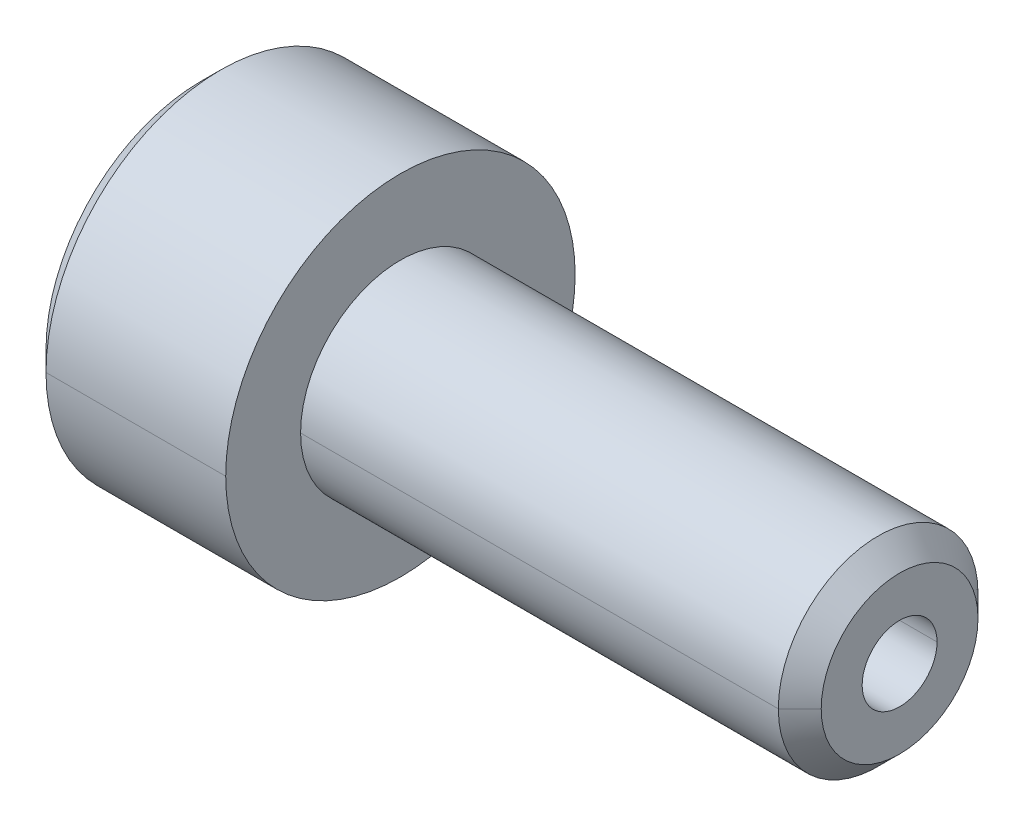
ISO-10303-21;
HEADER;
FILE_DESCRIPTION(('STEP AP214'),'2;1');
FILE_NAME('part.step','',(''),(''),'','','');
FILE_SCHEMA(('AUTOMOTIVE_DESIGN { 1 0 10303 214 1 1 1 1 }'));
ENDSEC;
DATA;
#1=APPLICATION_CONTEXT('core data for automotive mechanical design processes');
#2=APPLICATION_PROTOCOL_DEFINITION('international standard','automotive_design',2000,#1);
#3=PRODUCT_CONTEXT('',#1,'mechanical');
#4=PRODUCT('Part','Part','',(#3));
#5=PRODUCT_RELATED_PRODUCT_CATEGORY('part','',(#4));
#6=PRODUCT_DEFINITION_FORMATION('','',#4);
#7=PRODUCT_DEFINITION_CONTEXT('part definition',#1,'design');
#8=PRODUCT_DEFINITION('design','',#6,#7);
#9=PRODUCT_DEFINITION_SHAPE('','',#8);
#10=(LENGTH_UNIT() NAMED_UNIT(*) SI_UNIT(.MILLI.,.METRE.));
#11=(NAMED_UNIT(*) PLANE_ANGLE_UNIT() SI_UNIT($,.RADIAN.));
#12=(NAMED_UNIT(*) SI_UNIT($,.STERADIAN.) SOLID_ANGLE_UNIT());
#13=UNCERTAINTY_MEASURE_WITH_UNIT(LENGTH_MEASURE(1.E-05),#10,'distance_accuracy_value','');
#14=(GEOMETRIC_REPRESENTATION_CONTEXT(3) GLOBAL_UNCERTAINTY_ASSIGNED_CONTEXT((#13)) GLOBAL_UNIT_ASSIGNED_CONTEXT((#10,
#11,#12)) REPRESENTATION_CONTEXT('',''));
#15=CARTESIAN_POINT('',(0.,0.,0.));
#16=DIRECTION('',(0.,0.,1.));
#17=DIRECTION('',(1.,0.,0.));
#18=AXIS2_PLACEMENT_3D('',#15,#16,#17);
#19=CARTESIAN_POINT('',(-4.,0.,0.));
#20=DIRECTION('',(1.,0.,0.));
#21=DIRECTION('',(0.,0.,-1.));
#22=AXIS2_PLACEMENT_3D('',#19,#20,#21);
#23=PLANE('',#22);
#24=CARTESIAN_POINT('',(-4.,0.,0.));
#25=DIRECTION('',(1.,0.,0.));
#26=DIRECTION('',(0.,0.,-1.));
#27=AXIS2_PLACEMENT_3D('',#24,#25,#26);
#28=CIRCLE('',#27,3.1);
#29=CARTESIAN_POINT('',(-4.,0.,3.1));
#30=VERTEX_POINT('',#29);
#31=CARTESIAN_POINT('',(-4.,0.,-3.1));
#32=VERTEX_POINT('',#31);
#33=EDGE_CURVE('E11',#30,#32,#28,.T.);
#34=ORIENTED_EDGE('',*,*,#33,.F.);
#35=CARTESIAN_POINT('',(-4.,0.,0.));
#36=DIRECTION('',(1.,0.,0.));
#37=DIRECTION('',(0.,0.,-1.));
#38=AXIS2_PLACEMENT_3D('',#35,#36,#37);
#39=CIRCLE('',#38,3.1);
#40=EDGE_CURVE('E24',#32,#30,#39,.T.);
#41=ORIENTED_EDGE('',*,*,#40,.F.);
#42=EDGE_LOOP('',(#34,#41));
#43=FACE_BOUND('',#42,.T.);
#44=DIRECTION('',(0.,0.500000000000009,-0.866025403784433));
#45=VECTOR('',#44,1.);
#46=CARTESIAN_POINT('',(-4.,-1.7320508075689,0.));
#47=LINE('',#46,#45);
#48=CARTESIAN_POINT('',(-4.,-1.7320508075689,0.));
#49=VERTEX_POINT('',#48);
#50=CARTESIAN_POINT('',(-4.,-0.86602540378444,-1.5));
#51=VERTEX_POINT('',#50);
#52=EDGE_CURVE('E370',#49,#51,#47,.T.);
#53=ORIENTED_EDGE('',*,*,#52,.T.);
#54=DIRECTION('',(0.,1.,0.));
#55=VECTOR('',#54,1.);
#56=CARTESIAN_POINT('',(-4.,-0.86602540378444,-1.5));
#57=LINE('',#56,#55);
#58=CARTESIAN_POINT('',(-4.,0.86602540378444,-1.5));
#59=VERTEX_POINT('',#58);
#60=EDGE_CURVE('E366',#51,#59,#57,.T.);
#61=ORIENTED_EDGE('',*,*,#60,.T.);
#62=DIRECTION('',(0.,0.500000000000009,0.866025403784433));
#63=VECTOR('',#62,1.);
#64=CARTESIAN_POINT('',(-4.,0.86602540378444,-1.5));
#65=LINE('',#64,#63);
#66=CARTESIAN_POINT('',(-4.,1.7320508075689,0.));
#67=VERTEX_POINT('',#66);
#68=EDGE_CURVE('E362',#59,#67,#65,.T.);
#69=ORIENTED_EDGE('',*,*,#68,.T.);
#70=DIRECTION('',(0.,-0.500000000000009,0.866025403784433));
#71=VECTOR('',#70,1.);
#72=CARTESIAN_POINT('',(-4.,1.7320508075689,0.));
#73=LINE('',#72,#71);
#74=CARTESIAN_POINT('',(-4.,0.86602540378444,1.5));
#75=VERTEX_POINT('',#74);
#76=EDGE_CURVE('E358',#67,#75,#73,.T.);
#77=ORIENTED_EDGE('',*,*,#76,.T.);
#78=DIRECTION('',(0.,-1.,0.));
#79=VECTOR('',#78,1.);
#80=CARTESIAN_POINT('',(-4.,0.86602540378444,1.5));
#81=LINE('',#80,#79);
#82=CARTESIAN_POINT('',(-4.,-0.86602540378444,1.5));
#83=VERTEX_POINT('',#82);
#84=EDGE_CURVE('E354',#75,#83,#81,.T.);
#85=ORIENTED_EDGE('',*,*,#84,.T.);
#86=DIRECTION('',(0.,-0.500000000000009,-0.866025403784433));
#87=VECTOR('',#86,1.);
#88=CARTESIAN_POINT('',(-4.,-0.86602540378444,1.5));
#89=LINE('',#88,#87);
#90=EDGE_CURVE('E350',#83,#49,#89,.T.);
#91=ORIENTED_EDGE('',*,*,#90,.T.);
#92=EDGE_LOOP('',(#53,#61,#69,#77,#85,#91));
#93=FACE_BOUND('',#92,.T.);
#94=ADVANCED_FACE('F16',(#43,#93),#23,.F.);
#95=CARTESIAN_POINT('',(-2.,-0.86602540378444,1.5));
#96=DIRECTION('',(0.,0.866025403784434,-0.500000000000009));
#97=DIRECTION('',(0.,0.500000000000009,0.866025403784434));
#98=AXIS2_PLACEMENT_3D('',#95,#96,#97);
#99=PLANE('',#98);
#100=ORIENTED_EDGE('',*,*,#90,.F.);
#101=DIRECTION('',(-1.,0.,0.));
#102=VECTOR('',#101,1.);
#103=CARTESIAN_POINT('',(-2.,-0.86602540378444,1.5));
#104=LINE('',#103,#102);
#105=CARTESIAN_POINT('',(-2.,-0.86602540378444,1.5));
#106=VERTEX_POINT('',#105);
#107=EDGE_CURVE('E345',#106,#83,#104,.T.);
#108=ORIENTED_EDGE('',*,*,#107,.F.);
#109=DIRECTION('',(0.,-0.500000000000009,-0.866025403784433));
#110=VECTOR('',#109,1.);
#111=CARTESIAN_POINT('',(-2.,-0.86602540378444,1.5));
#112=LINE('',#111,#110);
#113=CARTESIAN_POINT('',(-2.,-1.29903810567666,0.750000000000019));
#114=VERTEX_POINT('',#113);
#115=EDGE_CURVE('E341',#106,#114,#112,.T.);
#116=ORIENTED_EDGE('',*,*,#115,.T.);
#117=DIRECTION('',(0.,-0.500000000000009,-0.866025403784433));
#118=VECTOR('',#117,1.);
#119=CARTESIAN_POINT('',(-2.,-0.86602540378444,1.5));
#120=LINE('',#119,#118);
#121=CARTESIAN_POINT('',(-2.,-1.7320508075689,0.));
#122=VERTEX_POINT('',#121);
#123=EDGE_CURVE('E337',#114,#122,#120,.T.);
#124=ORIENTED_EDGE('',*,*,#123,.T.);
#125=DIRECTION('',(-1.,0.,0.));
#126=VECTOR('',#125,1.);
#127=CARTESIAN_POINT('',(-2.,-1.7320508075689,0.));
#128=LINE('',#127,#126);
#129=EDGE_CURVE('E332',#122,#49,#128,.T.);
#130=ORIENTED_EDGE('',*,*,#129,.T.);
#131=EDGE_LOOP('',(#100,#108,#116,#124,#130));
#132=FACE_BOUND('',#131,.T.);
#133=ADVANCED_FACE('F409',(#132),#99,.T.);
#134=CARTESIAN_POINT('',(-2.,-1.7320508075689,0.));
#135=DIRECTION('',(0.,0.866025403784434,0.500000000000009));
#136=DIRECTION('',(0.,-0.500000000000009,0.866025403784434));
#137=AXIS2_PLACEMENT_3D('',#134,#135,#136);
#138=PLANE('',#137);
#139=ORIENTED_EDGE('',*,*,#52,.F.);
#140=ORIENTED_EDGE('',*,*,#129,.F.);
#141=DIRECTION('',(0.,0.500000000000009,-0.866025403784433));
#142=VECTOR('',#141,1.);
#143=CARTESIAN_POINT('',(-2.,-1.7320508075689,0.));
#144=LINE('',#143,#142);
#145=CARTESIAN_POINT('',(-2.,-1.29903810567665,-0.750000000000014));
#146=VERTEX_POINT('',#145);
#147=EDGE_CURVE('E328',#122,#146,#144,.T.);
#148=ORIENTED_EDGE('',*,*,#147,.T.);
#149=DIRECTION('',(0.,0.500000000000009,-0.866025403784433));
#150=VECTOR('',#149,1.);
#151=CARTESIAN_POINT('',(-2.,-1.7320508075689,0.));
#152=LINE('',#151,#150);
#153=CARTESIAN_POINT('',(-2.,-0.86602540378444,-1.5));
#154=VERTEX_POINT('',#153);
#155=EDGE_CURVE('E324',#146,#154,#152,.T.);
#156=ORIENTED_EDGE('',*,*,#155,.T.);
#157=DIRECTION('',(-1.,0.,0.));
#158=VECTOR('',#157,1.);
#159=CARTESIAN_POINT('',(-2.,-0.86602540378444,-1.5));
#160=LINE('',#159,#158);
#161=EDGE_CURVE('E319',#154,#51,#160,.T.);
#162=ORIENTED_EDGE('',*,*,#161,.T.);
#163=EDGE_LOOP('',(#139,#140,#148,#156,#162));
#164=FACE_BOUND('',#163,.T.);
#165=ADVANCED_FACE('F385',(#164),#138,.T.);
#166=CARTESIAN_POINT('',(-2.,-0.86602540378444,-1.5));
#167=DIRECTION('',(0.,0.,1.));
#168=DIRECTION('',(1.,0.,0.));
#169=AXIS2_PLACEMENT_3D('',#166,#167,#168);
#170=PLANE('',#169);
#171=ORIENTED_EDGE('',*,*,#60,.F.);
#172=ORIENTED_EDGE('',*,*,#161,.F.);
#173=DIRECTION('',(0.,1.,0.));
#174=VECTOR('',#173,1.);
#175=CARTESIAN_POINT('',(-2.,-0.86602540378444,-1.5));
#176=LINE('',#175,#174);
#177=CARTESIAN_POINT('',(-2.,0.,-1.5));
#178=VERTEX_POINT('',#177);
#179=EDGE_CURVE('E315',#154,#178,#176,.T.);
#180=ORIENTED_EDGE('',*,*,#179,.T.);
#181=DIRECTION('',(0.,1.,0.));
#182=VECTOR('',#181,1.);
#183=CARTESIAN_POINT('',(-2.,-0.86602540378444,-1.5));
#184=LINE('',#183,#182);
#185=CARTESIAN_POINT('',(-2.,0.86602540378444,-1.5));
#186=VERTEX_POINT('',#185);
#187=EDGE_CURVE('E311',#178,#186,#184,.T.);
#188=ORIENTED_EDGE('',*,*,#187,.T.);
#189=DIRECTION('',(-1.,0.,0.));
#190=VECTOR('',#189,1.);
#191=CARTESIAN_POINT('',(-2.,0.86602540378444,-1.5));
#192=LINE('',#191,#190);
#193=EDGE_CURVE('E306',#186,#59,#192,.T.);
#194=ORIENTED_EDGE('',*,*,#193,.T.);
#195=EDGE_LOOP('',(#171,#172,#180,#188,#194));
#196=FACE_BOUND('',#195,.T.);
#197=ADVANCED_FACE('F389',(#196),#170,.T.);
#198=CARTESIAN_POINT('',(-2.,0.86602540378444,-1.5));
#199=DIRECTION('',(0.,-0.866025403784434,0.500000000000009));
#200=DIRECTION('',(0.,-0.500000000000009,-0.866025403784434));
#201=AXIS2_PLACEMENT_3D('',#198,#199,#200);
#202=PLANE('',#201);
#203=ORIENTED_EDGE('',*,*,#68,.F.);
#204=ORIENTED_EDGE('',*,*,#193,.F.);
#205=DIRECTION('',(0.,0.500000000000009,0.866025403784433));
#206=VECTOR('',#205,1.);
#207=CARTESIAN_POINT('',(-2.,0.86602540378444,-1.5));
#208=LINE('',#207,#206);
#209=CARTESIAN_POINT('',(-2.,1.29903810567666,-0.750000000000019));
#210=VERTEX_POINT('',#209);
#211=EDGE_CURVE('E302',#186,#210,#208,.T.);
#212=ORIENTED_EDGE('',*,*,#211,.T.);
#213=DIRECTION('',(0.,0.500000000000009,0.866025403784433));
#214=VECTOR('',#213,1.);
#215=CARTESIAN_POINT('',(-2.,0.86602540378444,-1.5));
#216=LINE('',#215,#214);
#217=CARTESIAN_POINT('',(-2.,1.7320508075689,0.));
#218=VERTEX_POINT('',#217);
#219=EDGE_CURVE('E298',#210,#218,#216,.T.);
#220=ORIENTED_EDGE('',*,*,#219,.T.);
#221=DIRECTION('',(-1.,0.,0.));
#222=VECTOR('',#221,1.);
#223=CARTESIAN_POINT('',(-2.,1.7320508075689,0.));
#224=LINE('',#223,#222);
#225=EDGE_CURVE('E293',#218,#67,#224,.T.);
#226=ORIENTED_EDGE('',*,*,#225,.T.);
#227=EDGE_LOOP('',(#203,#204,#212,#220,#226));
#228=FACE_BOUND('',#227,.T.);
#229=ADVANCED_FACE('F395',(#228),#202,.T.);
#230=CARTESIAN_POINT('',(-2.,1.7320508075689,0.));
#231=DIRECTION('',(0.,-0.866025403784434,-0.500000000000009));
#232=DIRECTION('',(0.,0.500000000000009,-0.866025403784434));
#233=AXIS2_PLACEMENT_3D('',#230,#231,#232);
#234=PLANE('',#233);
#235=ORIENTED_EDGE('',*,*,#76,.F.);
#236=ORIENTED_EDGE('',*,*,#225,.F.);
#237=DIRECTION('',(0.,-0.500000000000009,0.866025403784433));
#238=VECTOR('',#237,1.);
#239=CARTESIAN_POINT('',(-2.,1.7320508075689,0.));
#240=LINE('',#239,#238);
#241=CARTESIAN_POINT('',(-2.,1.29903810567666,0.750000000000019));
#242=VERTEX_POINT('',#241);
#243=EDGE_CURVE('E289',#218,#242,#240,.T.);
#244=ORIENTED_EDGE('',*,*,#243,.T.);
#245=DIRECTION('',(0.,-0.500000000000009,0.866025403784433));
#246=VECTOR('',#245,1.);
#247=CARTESIAN_POINT('',(-2.,1.7320508075689,0.));
#248=LINE('',#247,#246);
#249=CARTESIAN_POINT('',(-2.,0.86602540378444,1.5));
#250=VERTEX_POINT('',#249);
#251=EDGE_CURVE('E285',#242,#250,#248,.T.);
#252=ORIENTED_EDGE('',*,*,#251,.T.);
#253=DIRECTION('',(-1.,0.,0.));
#254=VECTOR('',#253,1.);
#255=CARTESIAN_POINT('',(-2.,0.86602540378444,1.5));
#256=LINE('',#255,#254);
#257=EDGE_CURVE('E280',#250,#75,#256,.T.);
#258=ORIENTED_EDGE('',*,*,#257,.T.);
#259=EDGE_LOOP('',(#235,#236,#244,#252,#258));
#260=FACE_BOUND('',#259,.T.);
#261=ADVANCED_FACE('F401',(#260),#234,.T.);
#262=CARTESIAN_POINT('',(-2.,0.86602540378444,1.5));
#263=DIRECTION('',(0.,0.,-1.));
#264=DIRECTION('',(-1.,0.,0.));
#265=AXIS2_PLACEMENT_3D('',#262,#263,#264);
#266=PLANE('',#265);
#267=ORIENTED_EDGE('',*,*,#84,.F.);
#268=ORIENTED_EDGE('',*,*,#257,.F.);
#269=DIRECTION('',(0.,-1.,0.));
#270=VECTOR('',#269,1.);
#271=CARTESIAN_POINT('',(-2.,0.86602540378444,1.5));
#272=LINE('',#271,#270);
#273=CARTESIAN_POINT('',(-2.,0.,1.5));
#274=VERTEX_POINT('',#273);
#275=EDGE_CURVE('E276',#250,#274,#272,.T.);
#276=ORIENTED_EDGE('',*,*,#275,.T.);
#277=DIRECTION('',(0.,-1.,0.));
#278=VECTOR('',#277,1.);
#279=CARTESIAN_POINT('',(-2.,0.86602540378444,1.5));
#280=LINE('',#279,#278);
#281=EDGE_CURVE('E271',#274,#106,#280,.T.);
#282=ORIENTED_EDGE('',*,*,#281,.T.);
#283=ORIENTED_EDGE('',*,*,#107,.T.);
#284=EDGE_LOOP('',(#267,#268,#276,#282,#283));
#285=FACE_BOUND('',#284,.T.);
#286=ADVANCED_FACE('F405',(#285),#266,.T.);
#287=CARTESIAN_POINT('',(-2.,0.,0.));
#288=DIRECTION('',(1.,0.,0.));
#289=DIRECTION('',(0.,0.,-1.));
#290=AXIS2_PLACEMENT_3D('',#287,#288,#289);
#291=PLANE('',#290);
#292=CARTESIAN_POINT('',(-2.,0.,0.));
#293=DIRECTION('',(1.,0.,0.));
#294=DIRECTION('',(0.,0.,-1.));
#295=AXIS2_PLACEMENT_3D('',#292,#293,#294);
#296=CIRCLE('',#295,1.5);
#297=EDGE_CURVE('E266',#274,#114,#296,.T.);
#298=ORIENTED_EDGE('',*,*,#297,.T.);
#299=ORIENTED_EDGE('',*,*,#115,.F.);
#300=ORIENTED_EDGE('',*,*,#281,.F.);
#301=EDGE_LOOP('',(#298,#299,#300));
#302=FACE_BOUND('',#301,.T.);
#303=ADVANCED_FACE('F451',(#302),#291,.F.);
#304=CARTESIAN_POINT('',(-2.,0.,0.));
#305=DIRECTION('',(-1.,0.,0.));
#306=DIRECTION('',(0.,1.,0.));
#307=AXIS2_PLACEMENT_3D('',#304,#305,#306);
#308=CONICAL_SURFACE('',#307,1.5,1.04719755119662);
#309=DIRECTION('',(-0.499999999999984,0.,-0.866025403784448));
#310=VECTOR('',#309,1.);
#311=CARTESIAN_POINT('',(-1.5669872981078,0.,-0.75));
#312=LINE('',#311,#310);
#313=CARTESIAN_POINT('',(-1.5669872981078,0.,-0.75));
#314=VERTEX_POINT('',#313);
#315=EDGE_CURVE('E261',#314,#178,#312,.T.);
#316=ORIENTED_EDGE('',*,*,#315,.T.);
#317=CARTESIAN_POINT('',(-2.,0.,0.));
#318=DIRECTION('',(1.,0.,0.));
#319=DIRECTION('',(0.,0.,-1.));
#320=AXIS2_PLACEMENT_3D('',#317,#318,#319);
#321=CIRCLE('',#320,1.5);
#322=EDGE_CURVE('E256',#146,#178,#321,.T.);
#323=ORIENTED_EDGE('',*,*,#322,.F.);
#324=CARTESIAN_POINT('',(-2.,0.,0.));
#325=DIRECTION('',(1.,0.,0.));
#326=DIRECTION('',(0.,0.,-1.));
#327=AXIS2_PLACEMENT_3D('',#324,#325,#326);
#328=CIRCLE('',#327,1.5);
#329=EDGE_CURVE('E251',#114,#146,#328,.T.);
#330=ORIENTED_EDGE('',*,*,#329,.F.);
#331=ORIENTED_EDGE('',*,*,#297,.F.);
#332=DIRECTION('',(-0.499999999999984,0.,0.866025403784448));
#333=VECTOR('',#332,1.);
#334=CARTESIAN_POINT('',(-1.5669872981078,0.,0.75));
#335=LINE('',#334,#333);
#336=CARTESIAN_POINT('',(-1.5669872981078,0.,0.75));
#337=VERTEX_POINT('',#336);
#338=EDGE_CURVE('E246',#337,#274,#335,.T.);
#339=ORIENTED_EDGE('',*,*,#338,.F.);
#340=CARTESIAN_POINT('',(-1.5669872981078,0.,0.));
#341=DIRECTION('',(-1.,0.,0.));
#342=DIRECTION('',(0.,0.,1.));
#343=AXIS2_PLACEMENT_3D('',#340,#341,#342);
#344=CIRCLE('',#343,0.75);
#345=EDGE_CURVE('E241',#314,#337,#344,.T.);
#346=ORIENTED_EDGE('',*,*,#345,.F.);
#347=EDGE_LOOP('',(#316,#323,#330,#331,#339,#346));
#348=FACE_BOUND('',#347,.T.);
#349=ADVANCED_FACE('F416',(#348),#308,.F.);
#350=CARTESIAN_POINT('',(80.,0.,0.));
#351=DIRECTION('',(1.,0.,0.));
#352=DIRECTION('',(0.,1.,0.));
#353=AXIS2_PLACEMENT_3D('',#350,#351,#352);
#354=CYLINDRICAL_SURFACE('',#353,0.75);
#355=DIRECTION('',(1.,0.,0.));
#356=VECTOR('',#355,1.);
#357=CARTESIAN_POINT('',(-1.5669872981078,0.,0.75));
#358=LINE('',#357,#356);
#359=CARTESIAN_POINT('',(10.,0.,0.75));
#360=VERTEX_POINT('',#359);
#361=EDGE_CURVE('E237',#337,#360,#358,.T.);
#362=ORIENTED_EDGE('',*,*,#361,.T.);
#363=CARTESIAN_POINT('',(10.,0.,0.));
#364=DIRECTION('',(1.,0.,0.));
#365=DIRECTION('',(0.,0.,1.));
#366=AXIS2_PLACEMENT_3D('',#363,#364,#365);
#367=CIRCLE('',#366,0.75);
#368=CARTESIAN_POINT('',(10.,0.,-0.75));
#369=VERTEX_POINT('',#368);
#370=EDGE_CURVE('E233',#360,#369,#367,.T.);
#371=ORIENTED_EDGE('',*,*,#370,.T.);
#372=DIRECTION('',(1.,0.,0.));
#373=VECTOR('',#372,1.);
#374=CARTESIAN_POINT('',(-1.5669872981078,0.,-0.75));
#375=LINE('',#374,#373);
#376=EDGE_CURVE('E228',#314,#369,#375,.T.);
#377=ORIENTED_EDGE('',*,*,#376,.F.);
#378=ORIENTED_EDGE('',*,*,#345,.T.);
#379=EDGE_LOOP('',(#362,#371,#377,#378));
#380=FACE_BOUND('',#379,.T.);
#381=ADVANCED_FACE('F457',(#380),#354,.F.);
#382=CARTESIAN_POINT('',(80.,0.,0.));
#383=DIRECTION('',(1.,0.,0.));
#384=DIRECTION('',(0.,-1.,0.));
#385=AXIS2_PLACEMENT_3D('',#382,#383,#384);
#386=CYLINDRICAL_SURFACE('',#385,0.75);
#387=ORIENTED_EDGE('',*,*,#361,.F.);
#388=CARTESIAN_POINT('',(-1.5669872981078,0.,0.));
#389=DIRECTION('',(-1.,0.,0.));
#390=DIRECTION('',(0.,0.,1.));
#391=AXIS2_PLACEMENT_3D('',#388,#389,#390);
#392=CIRCLE('',#391,0.75);
#393=EDGE_CURVE('E223',#337,#314,#392,.T.);
#394=ORIENTED_EDGE('',*,*,#393,.T.);
#395=ORIENTED_EDGE('',*,*,#376,.T.);
#396=CARTESIAN_POINT('',(10.,0.,0.));
#397=DIRECTION('',(1.,0.,0.));
#398=DIRECTION('',(0.,0.,1.));
#399=AXIS2_PLACEMENT_3D('',#396,#397,#398);
#400=CIRCLE('',#399,0.75);
#401=EDGE_CURVE('E218',#369,#360,#400,.T.);
#402=ORIENTED_EDGE('',*,*,#401,.T.);
#403=EDGE_LOOP('',(#387,#394,#395,#402));
#404=FACE_BOUND('',#403,.T.);
#405=ADVANCED_FACE('F460',(#404),#386,.F.);
#406=CARTESIAN_POINT('',(10.,1.5705,0.));
#407=DIRECTION('',(-1.,0.,0.));
#408=DIRECTION('',(0.,0.,1.));
#409=AXIS2_PLACEMENT_3D('',#406,#407,#408);
#410=PLANE('',#409);
#411=ORIENTED_EDGE('',*,*,#401,.F.);
#412=ORIENTED_EDGE('',*,*,#370,.F.);
#413=EDGE_LOOP('',(#411,#412));
#414=FACE_BOUND('',#413,.T.);
#415=CARTESIAN_POINT('',(10.,0.,0.));
#416=DIRECTION('',(1.,0.,0.));
#417=DIRECTION('',(0.,0.,-1.));
#418=AXIS2_PLACEMENT_3D('',#415,#416,#417);
#419=CIRCLE('',#418,1.5705);
#420=CARTESIAN_POINT('',(10.,0.,-1.5705));
#421=VERTEX_POINT('',#420);
#422=CARTESIAN_POINT('',(10.,0.,1.5705));
#423=VERTEX_POINT('',#422);
#424=EDGE_CURVE('E214',#421,#423,#419,.T.);
#425=ORIENTED_EDGE('',*,*,#424,.T.);
#426=CARTESIAN_POINT('',(10.,0.,0.));
#427=DIRECTION('',(1.,0.,0.));
#428=DIRECTION('',(0.,0.,-1.));
#429=AXIS2_PLACEMENT_3D('',#426,#427,#428);
#430=CIRCLE('',#429,1.5705);
#431=EDGE_CURVE('E210',#423,#421,#430,.T.);
#432=ORIENTED_EDGE('',*,*,#431,.T.);
#433=EDGE_LOOP('',(#425,#432));
#434=FACE_BOUND('',#433,.T.);
#435=ADVANCED_FACE('F464',(#414,#434),#410,.F.);
#436=CARTESIAN_POINT('',(9.5705,0.,0.));
#437=DIRECTION('',(-1.,0.,0.));
#438=DIRECTION('',(0.,1.,0.));
#439=AXIS2_PLACEMENT_3D('',#436,#437,#438);
#440=CONICAL_SURFACE('',#439,2.,0.785398163397448);
#441=DIRECTION('',(-0.707106781186548,0.,-0.707106781186547));
#442=VECTOR('',#441,1.);
#443=CARTESIAN_POINT('',(10.,0.,-1.5705));
#444=LINE('',#443,#442);
#445=CARTESIAN_POINT('',(9.5705,0.,-2.));
#446=VERTEX_POINT('',#445);
#447=EDGE_CURVE('E205',#421,#446,#444,.T.);
#448=ORIENTED_EDGE('',*,*,#447,.F.);
#449=ORIENTED_EDGE('',*,*,#431,.F.);
#450=DIRECTION('',(-0.707106781186548,0.,0.707106781186547));
#451=VECTOR('',#450,1.);
#452=CARTESIAN_POINT('',(10.,0.,1.5705));
#453=LINE('',#452,#451);
#454=CARTESIAN_POINT('',(9.5705,0.,2.));
#455=VERTEX_POINT('',#454);
#456=EDGE_CURVE('E201',#423,#455,#453,.T.);
#457=ORIENTED_EDGE('',*,*,#456,.T.);
#458=CARTESIAN_POINT('',(9.5705,0.,0.));
#459=DIRECTION('',(1.,0.,0.));
#460=DIRECTION('',(0.,0.,-1.));
#461=AXIS2_PLACEMENT_3D('',#458,#459,#460);
#462=CIRCLE('',#461,2.);
#463=EDGE_CURVE('E197',#455,#446,#462,.T.);
#464=ORIENTED_EDGE('',*,*,#463,.T.);
#465=EDGE_LOOP('',(#448,#449,#457,#464));
#466=FACE_BOUND('',#465,.T.);
#467=ADVANCED_FACE('F468',(#466),#440,.T.);
#468=CARTESIAN_POINT('',(10.,0.,0.));
#469=DIRECTION('',(1.,0.,0.));
#470=DIRECTION('',(0.,1.,0.));
#471=AXIS2_PLACEMENT_3D('',#468,#469,#470);
#472=CYLINDRICAL_SURFACE('',#471,2.);
#473=DIRECTION('',(1.,0.,0.));
#474=VECTOR('',#473,1.);
#475=CARTESIAN_POINT('',(0.,0.,2.));
#476=LINE('',#475,#474);
#477=CARTESIAN_POINT('',(0.,0.,2.));
#478=VERTEX_POINT('',#477);
#479=EDGE_CURVE('E192',#478,#455,#476,.T.);
#480=ORIENTED_EDGE('',*,*,#479,.F.);
#481=CARTESIAN_POINT('',(0.,0.,0.));
#482=DIRECTION('',(1.,0.,0.));
#483=DIRECTION('',(0.,0.,-1.));
#484=AXIS2_PLACEMENT_3D('',#481,#482,#483);
#485=CIRCLE('',#484,2.);
#486=CARTESIAN_POINT('',(0.,0.,-2.));
#487=VERTEX_POINT('',#486);
#488=EDGE_CURVE('E188',#478,#487,#485,.T.);
#489=ORIENTED_EDGE('',*,*,#488,.T.);
#490=DIRECTION('',(1.,0.,0.));
#491=VECTOR('',#490,1.);
#492=CARTESIAN_POINT('',(0.,0.,-2.));
#493=LINE('',#492,#491);
#494=EDGE_CURVE('E183',#487,#446,#493,.T.);
#495=ORIENTED_EDGE('',*,*,#494,.T.);
#496=ORIENTED_EDGE('',*,*,#463,.F.);
#497=EDGE_LOOP('',(#480,#489,#495,#496));
#498=FACE_BOUND('',#497,.T.);
#499=ADVANCED_FACE('F472',(#498),#472,.T.);
#500=CARTESIAN_POINT('',(10.,0.,0.));
#501=DIRECTION('',(1.,0.,0.));
#502=DIRECTION('',(0.,-1.,0.));
#503=AXIS2_PLACEMENT_3D('',#500,#501,#502);
#504=CYLINDRICAL_SURFACE('',#503,2.);
#505=ORIENTED_EDGE('',*,*,#479,.T.);
#506=CARTESIAN_POINT('',(9.5705,0.,0.));
#507=DIRECTION('',(1.,0.,0.));
#508=DIRECTION('',(0.,0.,-1.));
#509=AXIS2_PLACEMENT_3D('',#506,#507,#508);
#510=CIRCLE('',#509,2.);
#511=EDGE_CURVE('E178',#446,#455,#510,.T.);
#512=ORIENTED_EDGE('',*,*,#511,.F.);
#513=ORIENTED_EDGE('',*,*,#494,.F.);
#514=CARTESIAN_POINT('',(0.,0.,0.));
#515=DIRECTION('',(1.,0.,0.));
#516=DIRECTION('',(0.,0.,-1.));
#517=AXIS2_PLACEMENT_3D('',#514,#515,#516);
#518=CIRCLE('',#517,2.);
#519=EDGE_CURVE('E173',#487,#478,#518,.T.);
#520=ORIENTED_EDGE('',*,*,#519,.T.);
#521=EDGE_LOOP('',(#505,#512,#513,#520));
#522=FACE_BOUND('',#521,.T.);
#523=ADVANCED_FACE('F476',(#522),#504,.T.);
#524=CARTESIAN_POINT('',(0.,3.5,0.));
#525=DIRECTION('',(-1.,0.,0.));
#526=DIRECTION('',(0.,0.,1.));
#527=AXIS2_PLACEMENT_3D('',#524,#525,#526);
#528=PLANE('',#527);
#529=ORIENTED_EDGE('',*,*,#488,.F.);
#530=ORIENTED_EDGE('',*,*,#519,.F.);
#531=EDGE_LOOP('',(#529,#530));
#532=FACE_BOUND('',#531,.T.);
#533=CARTESIAN_POINT('',(0.,0.,0.));
#534=DIRECTION('',(1.,0.,0.));
#535=DIRECTION('',(0.,0.,-1.));
#536=AXIS2_PLACEMENT_3D('',#533,#534,#535);
#537=CIRCLE('',#536,3.5);
#538=CARTESIAN_POINT('',(0.,0.,-3.5));
#539=VERTEX_POINT('',#538);
#540=CARTESIAN_POINT('',(0.,0.,3.5));
#541=VERTEX_POINT('',#540);
#542=EDGE_CURVE('E156',#539,#541,#537,.T.);
#543=ORIENTED_EDGE('',*,*,#542,.T.);
#544=CARTESIAN_POINT('',(0.,0.,0.));
#545=DIRECTION('',(1.,0.,0.));
#546=DIRECTION('',(0.,0.,-1.));
#547=AXIS2_PLACEMENT_3D('',#544,#545,#546);
#548=CIRCLE('',#547,3.5);
#549=EDGE_CURVE('E166',#541,#539,#548,.T.);
#550=ORIENTED_EDGE('',*,*,#549,.T.);
#551=EDGE_LOOP('',(#543,#550));
#552=FACE_BOUND('',#551,.T.);
#553=ADVANCED_FACE('F480',(#532,#552),#528,.F.);
#554=CARTESIAN_POINT('',(10.,0.,0.));
#555=DIRECTION('',(1.,0.,0.));
#556=DIRECTION('',(0.,1.,0.));
#557=AXIS2_PLACEMENT_3D('',#554,#555,#556);
#558=CYLINDRICAL_SURFACE('',#557,3.5);
#559=DIRECTION('',(1.,0.,0.));
#560=VECTOR('',#559,1.);
#561=CARTESIAN_POINT('',(-3.6,0.,3.5));
#562=LINE('',#561,#560);
#563=CARTESIAN_POINT('',(-3.6,0.,3.5));
#564=VERTEX_POINT('',#563);
#565=EDGE_CURVE('E138',#564,#541,#562,.T.);
#566=ORIENTED_EDGE('',*,*,#565,.F.);
#567=CARTESIAN_POINT('',(-3.6,0.,0.));
#568=DIRECTION('',(1.,0.,0.));
#569=DIRECTION('',(0.,0.,-1.));
#570=AXIS2_PLACEMENT_3D('',#567,#568,#569);
#571=CIRCLE('',#570,3.5);
#572=CARTESIAN_POINT('',(-3.6,0.,-3.5));
#573=VERTEX_POINT('',#572);
#574=EDGE_CURVE('E131',#564,#573,#571,.T.);
#575=ORIENTED_EDGE('',*,*,#574,.T.);
#576=DIRECTION('',(1.,0.,0.));
#577=VECTOR('',#576,1.);
#578=CARTESIAN_POINT('',(-3.6,0.,-3.5));
#579=LINE('',#578,#577);
#580=EDGE_CURVE('E136',#573,#539,#579,.T.);
#581=ORIENTED_EDGE('',*,*,#580,.T.);
#582=ORIENTED_EDGE('',*,*,#549,.F.);
#583=EDGE_LOOP('',(#566,#575,#581,#582));
#584=FACE_BOUND('',#583,.T.);
#585=ADVANCED_FACE('F133',(#584),#558,.T.);
#586=CARTESIAN_POINT('',(10.,0.,0.));
#587=DIRECTION('',(1.,0.,0.));
#588=DIRECTION('',(0.,-1.,0.));
#589=AXIS2_PLACEMENT_3D('',#586,#587,#588);
#590=CYLINDRICAL_SURFACE('',#589,3.5);
#591=ORIENTED_EDGE('',*,*,#565,.T.);
#592=ORIENTED_EDGE('',*,*,#542,.F.);
#593=ORIENTED_EDGE('',*,*,#580,.F.);
#594=CARTESIAN_POINT('',(-3.6,0.,0.));
#595=DIRECTION('',(1.,0.,0.));
#596=DIRECTION('',(0.,0.,-1.));
#597=AXIS2_PLACEMENT_3D('',#594,#595,#596);
#598=CIRCLE('',#597,3.5);
#599=EDGE_CURVE('E150',#573,#564,#598,.T.);
#600=ORIENTED_EDGE('',*,*,#599,.T.);
#601=EDGE_LOOP('',(#591,#592,#593,#600));
#602=FACE_BOUND('',#601,.T.);
#603=ADVANCED_FACE('F155',(#602),#590,.T.);
#604=CARTESIAN_POINT('',(-4.,0.,0.));
#605=DIRECTION('',(1.,0.,0.));
#606=DIRECTION('',(0.,-1.,0.));
#607=AXIS2_PLACEMENT_3D('',#604,#605,#606);
#608=CONICAL_SURFACE('',#607,3.1,0.785398163397449);
#609=DIRECTION('',(0.707106781186547,0.,0.707106781186548));
#610=VECTOR('',#609,1.);
#611=CARTESIAN_POINT('',(-4.,0.,3.1));
#612=LINE('',#611,#610);
#613=EDGE_CURVE('E146',#30,#564,#612,.T.);
#614=ORIENTED_EDGE('',*,*,#613,.T.);
#615=ORIENTED_EDGE('',*,*,#599,.F.);
#616=DIRECTION('',(0.707106781186548,0.,-0.707106781186548));
#617=VECTOR('',#616,1.);
#618=CARTESIAN_POINT('',(-4.,0.,-3.1));
#619=LINE('',#618,#617);
#620=EDGE_CURVE('E142',#32,#573,#619,.T.);
#621=ORIENTED_EDGE('',*,*,#620,.F.);
#622=ORIENTED_EDGE('',*,*,#40,.T.);
#623=EDGE_LOOP('',(#614,#615,#621,#622));
#624=FACE_BOUND('',#623,.T.);
#625=ADVANCED_FACE('F151',(#624),#608,.T.);
#626=CARTESIAN_POINT('',(-4.,0.,0.));
#627=DIRECTION('',(1.,0.,0.));
#628=DIRECTION('',(0.,1.,0.));
#629=AXIS2_PLACEMENT_3D('',#626,#627,#628);
#630=CONICAL_SURFACE('',#629,3.1,0.785398163397449);
#631=ORIENTED_EDGE('',*,*,#613,.F.);
#632=ORIENTED_EDGE('',*,*,#33,.T.);
#633=ORIENTED_EDGE('',*,*,#620,.T.);
#634=ORIENTED_EDGE('',*,*,#574,.F.);
#635=EDGE_LOOP('',(#631,#632,#633,#634));
#636=FACE_BOUND('',#635,.T.);
#637=ADVANCED_FACE('F144',(#636),#630,.T.);
#638=CARTESIAN_POINT('',(9.5705,0.,0.));
#639=DIRECTION('',(-1.,0.,0.));
#640=DIRECTION('',(0.,-1.,0.));
#641=AXIS2_PLACEMENT_3D('',#638,#639,#640);
#642=CONICAL_SURFACE('',#641,2.,0.785398163397448);
#643=ORIENTED_EDGE('',*,*,#447,.T.);
#644=ORIENTED_EDGE('',*,*,#511,.T.);
#645=ORIENTED_EDGE('',*,*,#456,.F.);
#646=ORIENTED_EDGE('',*,*,#424,.F.);
#647=EDGE_LOOP('',(#643,#644,#645,#646));
#648=FACE_BOUND('',#647,.T.);
#649=ADVANCED_FACE('F493',(#648),#642,.T.);
#650=CARTESIAN_POINT('',(-2.,0.,0.));
#651=DIRECTION('',(-1.,0.,0.));
#652=DIRECTION('',(0.,-1.,0.));
#653=AXIS2_PLACEMENT_3D('',#650,#651,#652);
#654=CONICAL_SURFACE('',#653,1.5,1.04719755119662);
#655=ORIENTED_EDGE('',*,*,#315,.F.);
#656=ORIENTED_EDGE('',*,*,#393,.F.);
#657=ORIENTED_EDGE('',*,*,#338,.T.);
#658=CARTESIAN_POINT('',(-2.,0.,0.));
#659=DIRECTION('',(1.,0.,0.));
#660=DIRECTION('',(0.,0.,-1.));
#661=AXIS2_PLACEMENT_3D('',#658,#659,#660);
#662=CIRCLE('',#661,1.5);
#663=EDGE_CURVE('E147',#242,#274,#662,.T.);
#664=ORIENTED_EDGE('',*,*,#663,.F.);
#665=CARTESIAN_POINT('',(-2.,0.,0.));
#666=DIRECTION('',(1.,0.,0.));
#667=DIRECTION('',(0.,0.,-1.));
#668=AXIS2_PLACEMENT_3D('',#665,#666,#667);
#669=CIRCLE('',#668,1.5);
#670=EDGE_CURVE('E513',#210,#242,#669,.T.);
#671=ORIENTED_EDGE('',*,*,#670,.F.);
#672=CARTESIAN_POINT('',(-2.,0.,0.));
#673=DIRECTION('',(1.,0.,0.));
#674=DIRECTION('',(0.,0.,-1.));
#675=AXIS2_PLACEMENT_3D('',#672,#673,#674);
#676=CIRCLE('',#675,1.5);
#677=EDGE_CURVE('E517',#178,#210,#676,.T.);
#678=ORIENTED_EDGE('',*,*,#677,.F.);
#679=EDGE_LOOP('',(#655,#656,#657,#664,#671,#678));
#680=FACE_BOUND('',#679,.T.);
#681=ADVANCED_FACE('F496',(#680),#654,.F.);
#682=CARTESIAN_POINT('',(-2.,0.,0.));
#683=DIRECTION('',(1.,0.,0.));
#684=DIRECTION('',(0.,0.,-1.));
#685=AXIS2_PLACEMENT_3D('',#682,#683,#684);
#686=PLANE('',#685);
#687=ORIENTED_EDGE('',*,*,#677,.T.);
#688=ORIENTED_EDGE('',*,*,#211,.F.);
#689=ORIENTED_EDGE('',*,*,#187,.F.);
#690=EDGE_LOOP('',(#687,#688,#689));
#691=FACE_BOUND('',#690,.T.);
#692=ADVANCED_FACE('F500',(#691),#686,.F.);
#693=CARTESIAN_POINT('',(-2.,0.,0.));
#694=DIRECTION('',(1.,0.,0.));
#695=DIRECTION('',(0.,0.,-1.));
#696=AXIS2_PLACEMENT_3D('',#693,#694,#695);
#697=PLANE('',#696);
#698=ORIENTED_EDGE('',*,*,#219,.F.);
#699=ORIENTED_EDGE('',*,*,#670,.T.);
#700=ORIENTED_EDGE('',*,*,#243,.F.);
#701=EDGE_LOOP('',(#698,#699,#700));
#702=FACE_BOUND('',#701,.T.);
#703=ADVANCED_FACE('F431',(#702),#697,.F.);
#704=CARTESIAN_POINT('',(-2.,0.,0.));
#705=DIRECTION('',(1.,0.,0.));
#706=DIRECTION('',(0.,0.,-1.));
#707=AXIS2_PLACEMENT_3D('',#704,#705,#706);
#708=PLANE('',#707);
#709=ORIENTED_EDGE('',*,*,#663,.T.);
#710=ORIENTED_EDGE('',*,*,#275,.F.);
#711=ORIENTED_EDGE('',*,*,#251,.F.);
#712=EDGE_LOOP('',(#709,#710,#711));
#713=FACE_BOUND('',#712,.T.);
#714=ADVANCED_FACE('F423',(#713),#708,.F.);
#715=CARTESIAN_POINT('',(-2.,0.,0.));
#716=DIRECTION('',(1.,0.,0.));
#717=DIRECTION('',(0.,0.,-1.));
#718=AXIS2_PLACEMENT_3D('',#715,#716,#717);
#719=PLANE('',#718);
#720=ORIENTED_EDGE('',*,*,#329,.T.);
#721=ORIENTED_EDGE('',*,*,#147,.F.);
#722=ORIENTED_EDGE('',*,*,#123,.F.);
#723=EDGE_LOOP('',(#720,#721,#722));
#724=FACE_BOUND('',#723,.T.);
#725=ADVANCED_FACE('F421',(#724),#719,.F.);
#726=CARTESIAN_POINT('',(-2.,0.,0.));
#727=DIRECTION('',(1.,0.,0.));
#728=DIRECTION('',(0.,0.,-1.));
#729=AXIS2_PLACEMENT_3D('',#726,#727,#728);
#730=PLANE('',#729);
#731=ORIENTED_EDGE('',*,*,#322,.T.);
#732=ORIENTED_EDGE('',*,*,#179,.F.);
#733=ORIENTED_EDGE('',*,*,#155,.F.);
#734=EDGE_LOOP('',(#731,#732,#733));
#735=FACE_BOUND('',#734,.T.);
#736=ADVANCED_FACE('F420',(#735),#730,.F.);
#737=CLOSED_SHELL('',(#94,#133,#165,#197,#229,#261,#286,#303,#349,#381,#405,#435,#467,#499,#523,
#553,#585,#603,#625,#637,#649,#681,#692,#703,#714,#725,#736));
#738=MANIFOLD_SOLID_BREP('B1',#737);
#739=ADVANCED_BREP_SHAPE_REPRESENTATION('',(#18,#738),#14);
#740=SHAPE_DEFINITION_REPRESENTATION(#9,#739);
ENDSEC;
END-ISO-10303-21;
